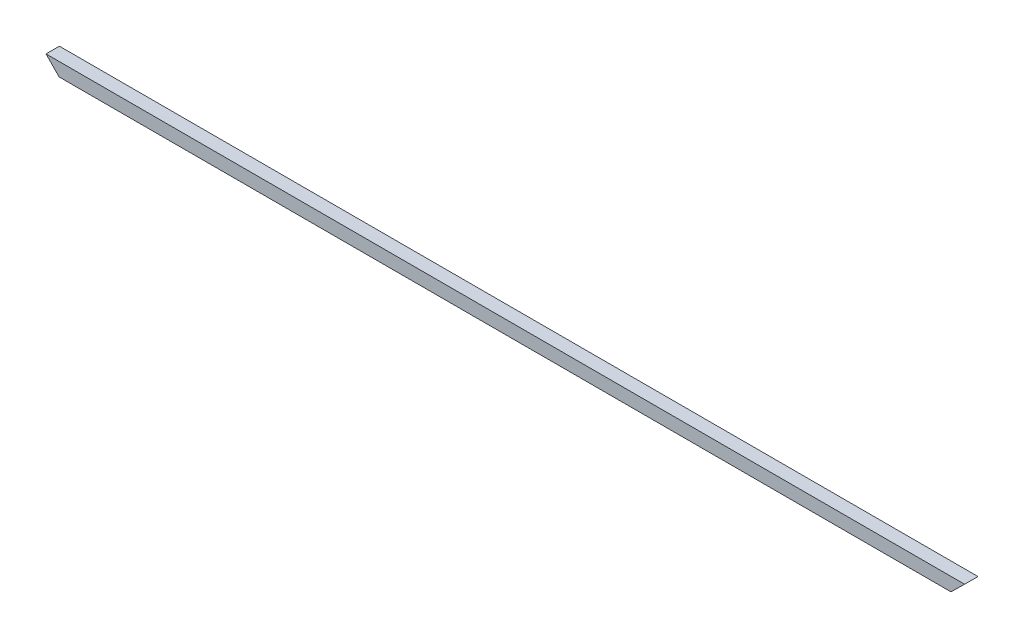
ISO-10303-21;
HEADER;
FILE_DESCRIPTION(('STEP AP214'),'2;1');
FILE_NAME('part.step','',(''),(''),'','','');
FILE_SCHEMA(('AUTOMOTIVE_DESIGN { 1 0 10303 214 1 1 1 1 }'));
ENDSEC;
DATA;
#1=APPLICATION_CONTEXT('core data for automotive mechanical design processes');
#2=APPLICATION_PROTOCOL_DEFINITION('international standard','automotive_design',2000,#1);
#3=PRODUCT_CONTEXT('',#1,'mechanical');
#4=PRODUCT('Part','Part','',(#3));
#5=PRODUCT_RELATED_PRODUCT_CATEGORY('part','',(#4));
#6=PRODUCT_DEFINITION_FORMATION('','',#4);
#7=PRODUCT_DEFINITION_CONTEXT('part definition',#1,'design');
#8=PRODUCT_DEFINITION('design','',#6,#7);
#9=PRODUCT_DEFINITION_SHAPE('','',#8);
#10=(LENGTH_UNIT() NAMED_UNIT(*) SI_UNIT(.MILLI.,.METRE.));
#11=(NAMED_UNIT(*) PLANE_ANGLE_UNIT() SI_UNIT($,.RADIAN.));
#12=(NAMED_UNIT(*) SI_UNIT($,.STERADIAN.) SOLID_ANGLE_UNIT());
#13=UNCERTAINTY_MEASURE_WITH_UNIT(LENGTH_MEASURE(1.E-05),#10,'distance_accuracy_value','');
#14=(GEOMETRIC_REPRESENTATION_CONTEXT(3) GLOBAL_UNCERTAINTY_ASSIGNED_CONTEXT((#13)) GLOBAL_UNIT_ASSIGNED_CONTEXT((#10,
#11,#12)) REPRESENTATION_CONTEXT('',''));
#15=CARTESIAN_POINT('',(0.,0.,0.));
#16=DIRECTION('',(0.,0.,1.));
#17=DIRECTION('',(1.,0.,0.));
#18=AXIS2_PLACEMENT_3D('',#15,#16,#17);
#19=CARTESIAN_POINT('',(-2680.45428248745,-40.0000000000003,40.));
#20=DIRECTION('',(0.7144726796328,0.699663340513369,0.));
#21=DIRECTION('',(-0.699663340513369,0.7144726796328,0.));
#22=AXIS2_PLACEMENT_3D('',#19,#20,#21);
#23=PLANE('',#22);
#24=DIRECTION('',(0.699663340513369,-0.7144726796328,0.));
#25=VECTOR('',#24,1.);
#26=CARTESIAN_POINT('',(-2680.45428248745,-40.0000000000003,0.));
#27=LINE('',#26,#25);
#28=CARTESIAN_POINT('',(-2719.62517651649,0.,0.));
#29=VERTEX_POINT('',#28);
#30=CARTESIAN_POINT('',(-2680.45428248745,-40.0000000000003,0.));
#31=VERTEX_POINT('',#30);
#32=EDGE_CURVE('E97',#29,#31,#27,.T.);
#33=ORIENTED_EDGE('',*,*,#32,.T.);
#34=DIRECTION('',(0.,0.,-1.));
#35=VECTOR('',#34,1.);
#36=CARTESIAN_POINT('',(-2680.45428248745,-40.0000000000003,40.));
#37=LINE('',#36,#35);
#38=CARTESIAN_POINT('',(-2680.45428248745,-40.0000000000003,40.));
#39=VERTEX_POINT('',#38);
#40=EDGE_CURVE('E11',#39,#31,#37,.T.);
#41=ORIENTED_EDGE('',*,*,#40,.F.);
#42=DIRECTION('',(0.699663340513369,-0.7144726796328,0.));
#43=VECTOR('',#42,1.);
#44=CARTESIAN_POINT('',(-2680.45428248745,-40.0000000000003,40.));
#45=LINE('',#44,#43);
#46=CARTESIAN_POINT('',(-2719.62517651649,0.,40.));
#47=VERTEX_POINT('',#46);
#48=EDGE_CURVE('E85',#47,#39,#45,.T.);
#49=ORIENTED_EDGE('',*,*,#48,.F.);
#50=DIRECTION('',(0.,0.,-1.));
#51=VECTOR('',#50,1.);
#52=CARTESIAN_POINT('',(-2719.62517651649,0.,40.));
#53=LINE('',#52,#51);
#54=EDGE_CURVE('E93',#47,#29,#53,.T.);
#55=ORIENTED_EDGE('',*,*,#54,.T.);
#56=EDGE_LOOP('',(#33,#41,#49,#55));
#57=FACE_BOUND('',#56,.T.);
#58=ADVANCED_FACE('F34',(#57),#23,.F.);
#59=CARTESIAN_POINT('',(-16.7718316582911,-40.,40.));
#60=DIRECTION('',(0.,1.,0.));
#61=DIRECTION('',(-1.,0.,0.));
#62=AXIS2_PLACEMENT_3D('',#59,#60,#61);
#63=PLANE('',#62);
#64=DIRECTION('',(1.,0.,0.));
#65=VECTOR('',#64,1.);
#66=CARTESIAN_POINT('',(-16.7718316582911,-40.,0.));
#67=LINE('',#66,#65);
#68=CARTESIAN_POINT('',(-16.7718316582911,-40.,0.));
#69=VERTEX_POINT('',#68);
#70=EDGE_CURVE('E89',#31,#69,#67,.T.);
#71=ORIENTED_EDGE('',*,*,#70,.T.);
#72=DIRECTION('',(0.,0.,-1.));
#73=VECTOR('',#72,1.);
#74=CARTESIAN_POINT('',(-16.7718316582911,-40.,40.));
#75=LINE('',#74,#73);
#76=CARTESIAN_POINT('',(-16.7718316582911,-40.,40.));
#77=VERTEX_POINT('',#76);
#78=EDGE_CURVE('E42',#77,#69,#75,.T.);
#79=ORIENTED_EDGE('',*,*,#78,.F.);
#80=DIRECTION('',(1.,0.,0.));
#81=VECTOR('',#80,1.);
#82=CARTESIAN_POINT('',(-16.7718316582911,-40.,40.));
#83=LINE('',#82,#81);
#84=EDGE_CURVE('E80',#39,#77,#83,.T.);
#85=ORIENTED_EDGE('',*,*,#84,.F.);
#86=ORIENTED_EDGE('',*,*,#40,.T.);
#87=EDGE_LOOP('',(#71,#79,#85,#86));
#88=FACE_BOUND('',#87,.T.);
#89=ADVANCED_FACE('F88',(#88),#63,.F.);
#90=CARTESIAN_POINT('',(24.0748234835136,0.,40.));
#91=DIRECTION('',(-0.699663340513362,0.714472679632807,0.));
#92=DIRECTION('',(-0.714472679632807,-0.699663340513362,0.));
#93=AXIS2_PLACEMENT_3D('',#90,#91,#92);
#94=PLANE('',#93);
#95=DIRECTION('',(0.714472679632807,0.699663340513362,0.));
#96=VECTOR('',#95,1.);
#97=CARTESIAN_POINT('',(24.0748234835136,0.,0.));
#98=LINE('',#97,#96);
#99=CARTESIAN_POINT('',(24.0748234835136,0.,0.));
#100=VERTEX_POINT('',#99);
#101=EDGE_CURVE('E67',#69,#100,#98,.T.);
#102=ORIENTED_EDGE('',*,*,#101,.T.);
#103=DIRECTION('',(0.,0.,-1.));
#104=VECTOR('',#103,1.);
#105=CARTESIAN_POINT('',(24.0748234835136,0.,40.));
#106=LINE('',#105,#104);
#107=CARTESIAN_POINT('',(24.0748234835136,0.,40.));
#108=VERTEX_POINT('',#107);
#109=EDGE_CURVE('E90',#108,#100,#106,.T.);
#110=ORIENTED_EDGE('',*,*,#109,.F.);
#111=DIRECTION('',(0.714472679632807,0.699663340513362,0.));
#112=VECTOR('',#111,1.);
#113=CARTESIAN_POINT('',(24.0748234835136,0.,40.));
#114=LINE('',#113,#112);
#115=EDGE_CURVE('E83',#77,#108,#114,.T.);
#116=ORIENTED_EDGE('',*,*,#115,.F.);
#117=ORIENTED_EDGE('',*,*,#78,.T.);
#118=EDGE_LOOP('',(#102,#110,#116,#117));
#119=FACE_BOUND('',#118,.T.);
#120=ADVANCED_FACE('F91',(#119),#94,.F.);
#121=CARTESIAN_POINT('',(-2719.62517651649,0.,40.));
#122=DIRECTION('',(0.,-1.,0.));
#123=DIRECTION('',(1.,0.,0.));
#124=AXIS2_PLACEMENT_3D('',#121,#122,#123);
#125=PLANE('',#124);
#126=DIRECTION('',(-1.,0.,0.));
#127=VECTOR('',#126,1.);
#128=CARTESIAN_POINT('',(-2719.62517651649,0.,0.));
#129=LINE('',#128,#127);
#130=EDGE_CURVE('E73',#100,#29,#129,.T.);
#131=ORIENTED_EDGE('',*,*,#130,.T.);
#132=ORIENTED_EDGE('',*,*,#54,.F.);
#133=DIRECTION('',(-1.,0.,0.));
#134=VECTOR('',#133,1.);
#135=CARTESIAN_POINT('',(-2719.62517651649,0.,40.));
#136=LINE('',#135,#134);
#137=EDGE_CURVE('E50',#108,#47,#136,.T.);
#138=ORIENTED_EDGE('',*,*,#137,.F.);
#139=ORIENTED_EDGE('',*,*,#109,.T.);
#140=EDGE_LOOP('',(#131,#132,#138,#139));
#141=FACE_BOUND('',#140,.T.);
#142=ADVANCED_FACE('F104',(#141),#125,.F.);
#143=CARTESIAN_POINT('',(0.,0.,40.));
#144=DIRECTION('',(0.,0.,1.));
#145=DIRECTION('',(1.,0.,0.));
#146=AXIS2_PLACEMENT_3D('',#143,#144,#145);
#147=PLANE('',#146);
#148=ORIENTED_EDGE('',*,*,#48,.T.);
#149=ORIENTED_EDGE('',*,*,#84,.T.);
#150=ORIENTED_EDGE('',*,*,#115,.T.);
#151=ORIENTED_EDGE('',*,*,#137,.T.);
#152=EDGE_LOOP('',(#148,#149,#150,#151));
#153=FACE_BOUND('',#152,.T.);
#154=ADVANCED_FACE('F81',(#153),#147,.T.);
#155=CARTESIAN_POINT('',(0.,0.,0.));
#156=DIRECTION('',(0.,0.,1.));
#157=DIRECTION('',(1.,0.,0.));
#158=AXIS2_PLACEMENT_3D('',#155,#156,#157);
#159=PLANE('',#158);
#160=ORIENTED_EDGE('',*,*,#32,.F.);
#161=ORIENTED_EDGE('',*,*,#130,.F.);
#162=ORIENTED_EDGE('',*,*,#101,.F.);
#163=ORIENTED_EDGE('',*,*,#70,.F.);
#164=EDGE_LOOP('',(#160,#161,#162,#163));
#165=FACE_BOUND('',#164,.T.);
#166=ADVANCED_FACE('F107',(#165),#159,.F.);
#167=CLOSED_SHELL('',(#58,#89,#120,#142,#154,#166));
#168=MANIFOLD_SOLID_BREP('B2',#167);
#169=ADVANCED_BREP_SHAPE_REPRESENTATION('',(#18,#168),#14);
#170=SHAPE_DEFINITION_REPRESENTATION(#9,#169);
ENDSEC;
END-ISO-10303-21;
